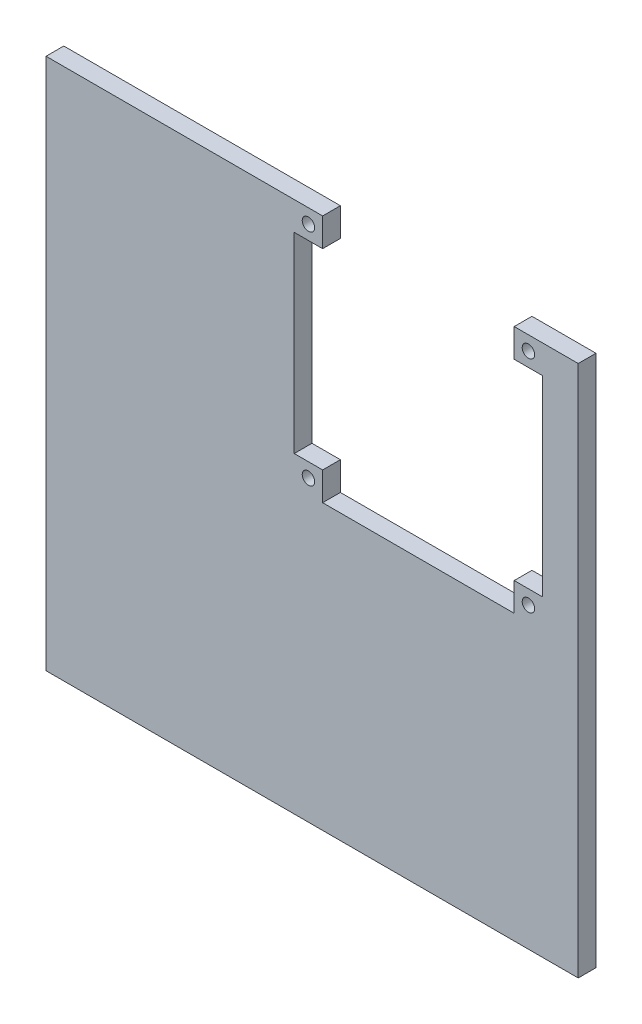
ISO-10303-21;
HEADER;
FILE_DESCRIPTION(('STEP AP214'),'2;1');
FILE_NAME('part.step','',(''),(''),'','','');
FILE_SCHEMA(('AUTOMOTIVE_DESIGN { 1 0 10303 214 1 1 1 1 }'));
ENDSEC;
DATA;
#1=APPLICATION_CONTEXT('core data for automotive mechanical design processes');
#2=APPLICATION_PROTOCOL_DEFINITION('international standard','automotive_design',2000,#1);
#3=PRODUCT_CONTEXT('',#1,'mechanical');
#4=PRODUCT('Part','Part','',(#3));
#5=PRODUCT_RELATED_PRODUCT_CATEGORY('part','',(#4));
#6=PRODUCT_DEFINITION_FORMATION('','',#4);
#7=PRODUCT_DEFINITION_CONTEXT('part definition',#1,'design');
#8=PRODUCT_DEFINITION('design','',#6,#7);
#9=PRODUCT_DEFINITION_SHAPE('','',#8);
#10=(LENGTH_UNIT() NAMED_UNIT(*) SI_UNIT(.MILLI.,.METRE.));
#11=(NAMED_UNIT(*) PLANE_ANGLE_UNIT() SI_UNIT($,.RADIAN.));
#12=(NAMED_UNIT(*) SI_UNIT($,.STERADIAN.) SOLID_ANGLE_UNIT());
#13=UNCERTAINTY_MEASURE_WITH_UNIT(LENGTH_MEASURE(1.E-05),#10,'distance_accuracy_value','');
#14=(GEOMETRIC_REPRESENTATION_CONTEXT(3) GLOBAL_UNCERTAINTY_ASSIGNED_CONTEXT((#13)) GLOBAL_UNIT_ASSIGNED_CONTEXT((#10,
#11,#12)) REPRESENTATION_CONTEXT('',''));
#15=CARTESIAN_POINT('',(0.,0.,0.));
#16=DIRECTION('',(0.,0.,1.));
#17=DIRECTION('',(1.,0.,0.));
#18=AXIS2_PLACEMENT_3D('',#15,#16,#17);
#19=CARTESIAN_POINT('',(0.,150.,5.));
#20=DIRECTION('',(0.,-1.,0.));
#21=DIRECTION('',(0.,0.,-1.));
#22=AXIS2_PLACEMENT_3D('',#19,#20,#21);
#23=PLANE('',#22);
#24=DIRECTION('',(-1.,0.,0.));
#25=VECTOR('',#24,1.);
#26=CARTESIAN_POINT('',(0.,150.,5.));
#27=LINE('',#26,#25);
#28=CARTESIAN_POINT('',(77.9600185654131,150.,5.));
#29=VERTEX_POINT('',#28);
#30=CARTESIAN_POINT('',(0.,150.,5.));
#31=VERTEX_POINT('',#30);
#32=EDGE_CURVE('E57',#29,#31,#27,.T.);
#33=ORIENTED_EDGE('',*,*,#32,.F.);
#34=DIRECTION('',(0.,0.,1.));
#35=VECTOR('',#34,1.);
#36=CARTESIAN_POINT('',(77.9600185654131,150.,0.));
#37=LINE('',#36,#35);
#38=CARTESIAN_POINT('',(77.9600185654131,150.,0.));
#39=VERTEX_POINT('',#38);
#40=EDGE_CURVE('E233',#39,#29,#37,.T.);
#41=ORIENTED_EDGE('',*,*,#40,.F.);
#42=DIRECTION('',(-1.,0.,0.));
#43=VECTOR('',#42,1.);
#44=CARTESIAN_POINT('',(0.,150.,0.));
#45=LINE('',#44,#43);
#46=CARTESIAN_POINT('',(0.,150.,0.));
#47=VERTEX_POINT('',#46);
#48=EDGE_CURVE('E79',#39,#47,#45,.T.);
#49=ORIENTED_EDGE('',*,*,#48,.T.);
#50=DIRECTION('',(0.,0.,-1.));
#51=VECTOR('',#50,1.);
#52=CARTESIAN_POINT('',(0.,150.,5.));
#53=LINE('',#52,#51);
#54=EDGE_CURVE('E265',#31,#47,#53,.T.);
#55=ORIENTED_EDGE('',*,*,#54,.F.);
#56=EDGE_LOOP('',(#33,#41,#49,#55));
#57=FACE_BOUND('',#56,.T.);
#58=ADVANCED_FACE('F33',(#57),#23,.F.);
#59=CARTESIAN_POINT('',(0.,0.,5.));
#60=DIRECTION('',(1.,0.,0.));
#61=DIRECTION('',(0.,0.,-1.));
#62=AXIS2_PLACEMENT_3D('',#59,#60,#61);
#63=PLANE('',#62);
#64=DIRECTION('',(0.,-1.,0.));
#65=VECTOR('',#64,1.);
#66=CARTESIAN_POINT('',(0.,0.,0.));
#67=LINE('',#66,#65);
#68=CARTESIAN_POINT('',(0.,0.,0.));
#69=VERTEX_POINT('',#68);
#70=EDGE_CURVE('E235',#47,#69,#67,.T.);
#71=ORIENTED_EDGE('',*,*,#70,.T.);
#72=DIRECTION('',(0.,0.,-1.));
#73=VECTOR('',#72,1.);
#74=CARTESIAN_POINT('',(0.,0.,5.));
#75=LINE('',#74,#73);
#76=CARTESIAN_POINT('',(0.,0.,5.));
#77=VERTEX_POINT('',#76);
#78=EDGE_CURVE('E11',#77,#69,#75,.T.);
#79=ORIENTED_EDGE('',*,*,#78,.F.);
#80=DIRECTION('',(0.,-1.,0.));
#81=VECTOR('',#80,1.);
#82=CARTESIAN_POINT('',(0.,0.,5.));
#83=LINE('',#82,#81);
#84=EDGE_CURVE('E256',#31,#77,#83,.T.);
#85=ORIENTED_EDGE('',*,*,#84,.F.);
#86=ORIENTED_EDGE('',*,*,#54,.T.);
#87=EDGE_LOOP('',(#71,#79,#85,#86));
#88=FACE_BOUND('',#87,.T.);
#89=ADVANCED_FACE('F35',(#88),#63,.F.);
#90=CARTESIAN_POINT('',(0.,0.,5.));
#91=DIRECTION('',(0.,1.,0.));
#92=DIRECTION('',(0.,0.,1.));
#93=AXIS2_PLACEMENT_3D('',#90,#91,#92);
#94=PLANE('',#93);
#95=DIRECTION('',(1.,0.,0.));
#96=VECTOR('',#95,1.);
#97=CARTESIAN_POINT('',(0.,0.,0.));
#98=LINE('',#97,#96);
#99=CARTESIAN_POINT('',(150.,0.,0.));
#100=VERTEX_POINT('',#99);
#101=EDGE_CURVE('E268',#69,#100,#98,.T.);
#102=ORIENTED_EDGE('',*,*,#101,.T.);
#103=DIRECTION('',(0.,0.,-1.));
#104=VECTOR('',#103,1.);
#105=CARTESIAN_POINT('',(150.,0.,5.));
#106=LINE('',#105,#104);
#107=CARTESIAN_POINT('',(150.,0.,5.));
#108=VERTEX_POINT('',#107);
#109=EDGE_CURVE('E41',#108,#100,#106,.T.);
#110=ORIENTED_EDGE('',*,*,#109,.F.);
#111=DIRECTION('',(1.,0.,0.));
#112=VECTOR('',#111,1.);
#113=CARTESIAN_POINT('',(0.,0.,5.));
#114=LINE('',#113,#112);
#115=EDGE_CURVE('E86',#77,#108,#114,.T.);
#116=ORIENTED_EDGE('',*,*,#115,.F.);
#117=ORIENTED_EDGE('',*,*,#78,.T.);
#118=EDGE_LOOP('',(#102,#110,#116,#117));
#119=FACE_BOUND('',#118,.T.);
#120=ADVANCED_FACE('F294',(#119),#94,.F.);
#121=CARTESIAN_POINT('',(150.,0.,5.));
#122=DIRECTION('',(-1.,0.,0.));
#123=DIRECTION('',(0.,0.,1.));
#124=AXIS2_PLACEMENT_3D('',#121,#122,#123);
#125=PLANE('',#124);
#126=DIRECTION('',(0.,1.,0.));
#127=VECTOR('',#126,1.);
#128=CARTESIAN_POINT('',(150.,0.,0.));
#129=LINE('',#128,#127);
#130=CARTESIAN_POINT('',(150.,150.,0.));
#131=VERTEX_POINT('',#130);
#132=EDGE_CURVE('E270',#100,#131,#129,.T.);
#133=ORIENTED_EDGE('',*,*,#132,.T.);
#134=DIRECTION('',(0.,0.,-1.));
#135=VECTOR('',#134,1.);
#136=CARTESIAN_POINT('',(150.,150.,5.));
#137=LINE('',#136,#135);
#138=CARTESIAN_POINT('',(150.,150.,5.));
#139=VERTEX_POINT('',#138);
#140=EDGE_CURVE('E275',#139,#131,#137,.T.);
#141=ORIENTED_EDGE('',*,*,#140,.F.);
#142=DIRECTION('',(0.,1.,0.));
#143=VECTOR('',#142,1.);
#144=CARTESIAN_POINT('',(150.,0.,5.));
#145=LINE('',#144,#143);
#146=EDGE_CURVE('E260',#108,#139,#145,.T.);
#147=ORIENTED_EDGE('',*,*,#146,.F.);
#148=ORIENTED_EDGE('',*,*,#109,.T.);
#149=EDGE_LOOP('',(#133,#141,#147,#148));
#150=FACE_BOUND('',#149,.T.);
#151=ADVANCED_FACE('F281',(#150),#125,.F.);
#152=CARTESIAN_POINT('',(131.960018565413,150.,0.));
#153=VERTEX_POINT('',#152);
#154=EDGE_CURVE('E258',#131,#153,#45,.T.);
#155=ORIENTED_EDGE('',*,*,#154,.T.);
#156=DIRECTION('',(0.,0.,1.));
#157=VECTOR('',#156,1.);
#158=CARTESIAN_POINT('',(131.960018565413,150.,0.));
#159=LINE('',#158,#157);
#160=CARTESIAN_POINT('',(131.960018565413,150.,5.));
#161=VERTEX_POINT('',#160);
#162=EDGE_CURVE('E236',#153,#161,#159,.T.);
#163=ORIENTED_EDGE('',*,*,#162,.T.);
#164=EDGE_CURVE('E262',#139,#161,#27,.T.);
#165=ORIENTED_EDGE('',*,*,#164,.F.);
#166=ORIENTED_EDGE('',*,*,#140,.T.);
#167=EDGE_LOOP('',(#155,#163,#165,#166));
#168=FACE_BOUND('',#167,.T.);
#169=ADVANCED_FACE('F286',(#168),#23,.F.);
#170=CARTESIAN_POINT('',(0.,0.,5.));
#171=DIRECTION('',(0.,0.,-1.));
#172=DIRECTION('',(-1.,0.,0.));
#173=AXIS2_PLACEMENT_3D('',#170,#171,#172);
#174=PLANE('',#173);
#175=CARTESIAN_POINT('',(135.960018565413,84.,5.));
#176=DIRECTION('',(0.,0.,1.));
#177=DIRECTION('',(1.,0.,0.));
#178=AXIS2_PLACEMENT_3D('',#175,#176,#177);
#179=CIRCLE('',#178,1.75000000000001);
#180=CARTESIAN_POINT('',(137.710018565413,84.,5.));
#181=VERTEX_POINT('',#180);
#182=EDGE_CURVE('E179',#181,#181,#179,.T.);
#183=ORIENTED_EDGE('',*,*,#182,.F.);
#184=EDGE_LOOP('',(#183));
#185=FACE_BOUND('',#184,.T.);
#186=CARTESIAN_POINT('',(135.960018565413,146.,5.));
#187=DIRECTION('',(0.,0.,1.));
#188=DIRECTION('',(1.,0.,0.));
#189=AXIS2_PLACEMENT_3D('',#186,#187,#188);
#190=CIRCLE('',#189,1.75000000000001);
#191=CARTESIAN_POINT('',(137.710018565413,146.,5.));
#192=VERTEX_POINT('',#191);
#193=EDGE_CURVE('E394',#192,#192,#190,.T.);
#194=ORIENTED_EDGE('',*,*,#193,.F.);
#195=EDGE_LOOP('',(#194));
#196=FACE_BOUND('',#195,.T.);
#197=CARTESIAN_POINT('',(73.9600185654131,146.,5.));
#198=DIRECTION('',(0.,0.,1.));
#199=DIRECTION('',(1.,0.,0.));
#200=AXIS2_PLACEMENT_3D('',#197,#198,#199);
#201=CIRCLE('',#200,1.75);
#202=CARTESIAN_POINT('',(75.7100185654131,146.,5.));
#203=VERTEX_POINT('',#202);
#204=EDGE_CURVE('E386',#203,#203,#201,.T.);
#205=ORIENTED_EDGE('',*,*,#204,.F.);
#206=EDGE_LOOP('',(#205));
#207=FACE_BOUND('',#206,.T.);
#208=CARTESIAN_POINT('',(73.960018565413,84.,5.));
#209=DIRECTION('',(0.,0.,1.));
#210=DIRECTION('',(1.,0.,0.));
#211=AXIS2_PLACEMENT_3D('',#208,#209,#210);
#212=CIRCLE('',#211,1.75);
#213=CARTESIAN_POINT('',(75.710018565413,84.,5.));
#214=VERTEX_POINT('',#213);
#215=EDGE_CURVE('E380',#214,#214,#212,.T.);
#216=ORIENTED_EDGE('',*,*,#215,.F.);
#217=EDGE_LOOP('',(#216));
#218=FACE_BOUND('',#217,.T.);
#219=DIRECTION('',(-1.,0.,0.));
#220=VECTOR('',#219,1.);
#221=CARTESIAN_POINT('',(69.960018565413,142.,5.));
#222=LINE('',#221,#220);
#223=CARTESIAN_POINT('',(77.9600185654131,142.,5.));
#224=VERTEX_POINT('',#223);
#225=CARTESIAN_POINT('',(69.960018565413,142.,5.));
#226=VERTEX_POINT('',#225);
#227=EDGE_CURVE('E207',#224,#226,#222,.T.);
#228=ORIENTED_EDGE('',*,*,#227,.F.);
#229=DIRECTION('',(0.,-1.,0.));
#230=VECTOR('',#229,1.);
#231=CARTESIAN_POINT('',(77.9600185654131,142.,5.));
#232=LINE('',#231,#230);
#233=EDGE_CURVE('E160',#29,#224,#232,.T.);
#234=ORIENTED_EDGE('',*,*,#233,.F.);
#235=ORIENTED_EDGE('',*,*,#32,.T.);
#236=ORIENTED_EDGE('',*,*,#84,.T.);
#237=ORIENTED_EDGE('',*,*,#115,.T.);
#238=ORIENTED_EDGE('',*,*,#146,.T.);
#239=ORIENTED_EDGE('',*,*,#164,.T.);
#240=DIRECTION('',(0.,1.,0.));
#241=VECTOR('',#240,1.);
#242=CARTESIAN_POINT('',(131.960018565413,150.,5.));
#243=LINE('',#242,#241);
#244=CARTESIAN_POINT('',(131.960018565413,142.,5.));
#245=VERTEX_POINT('',#244);
#246=EDGE_CURVE('E174',#245,#161,#243,.T.);
#247=ORIENTED_EDGE('',*,*,#246,.F.);
#248=DIRECTION('',(-1.,0.,0.));
#249=VECTOR('',#248,1.);
#250=CARTESIAN_POINT('',(131.960018565413,142.,5.));
#251=LINE('',#250,#249);
#252=CARTESIAN_POINT('',(139.960018565413,142.,5.));
#253=VERTEX_POINT('',#252);
#254=EDGE_CURVE('E176',#253,#245,#251,.T.);
#255=ORIENTED_EDGE('',*,*,#254,.F.);
#256=DIRECTION('',(0.,1.,0.));
#257=VECTOR('',#256,1.);
#258=CARTESIAN_POINT('',(139.960018565413,142.,5.));
#259=LINE('',#258,#257);
#260=CARTESIAN_POINT('',(139.960018565413,88.,5.));
#261=VERTEX_POINT('',#260);
#262=EDGE_CURVE('E228',#261,#253,#259,.T.);
#263=ORIENTED_EDGE('',*,*,#262,.F.);
#264=DIRECTION('',(1.,0.,0.));
#265=VECTOR('',#264,1.);
#266=CARTESIAN_POINT('',(139.960018565413,88.,5.));
#267=LINE('',#266,#265);
#268=CARTESIAN_POINT('',(131.960018565413,88.,5.));
#269=VERTEX_POINT('',#268);
#270=EDGE_CURVE('E225',#269,#261,#267,.T.);
#271=ORIENTED_EDGE('',*,*,#270,.F.);
#272=DIRECTION('',(0.,1.,0.));
#273=VECTOR('',#272,1.);
#274=CARTESIAN_POINT('',(131.960018565413,88.,5.));
#275=LINE('',#274,#273);
#276=CARTESIAN_POINT('',(131.960018565413,80.,5.));
#277=VERTEX_POINT('',#276);
#278=EDGE_CURVE('E222',#277,#269,#275,.T.);
#279=ORIENTED_EDGE('',*,*,#278,.F.);
#280=DIRECTION('',(1.,0.,0.));
#281=VECTOR('',#280,1.);
#282=CARTESIAN_POINT('',(131.960018565413,80.,5.));
#283=LINE('',#282,#281);
#284=CARTESIAN_POINT('',(77.9600185654131,80.,5.));
#285=VERTEX_POINT('',#284);
#286=EDGE_CURVE('E219',#285,#277,#283,.T.);
#287=ORIENTED_EDGE('',*,*,#286,.F.);
#288=DIRECTION('',(0.,-1.,0.));
#289=VECTOR('',#288,1.);
#290=CARTESIAN_POINT('',(77.9600185654131,80.,5.));
#291=LINE('',#290,#289);
#292=CARTESIAN_POINT('',(77.9600185654131,87.9999999999999,5.));
#293=VERTEX_POINT('',#292);
#294=EDGE_CURVE('E216',#293,#285,#291,.T.);
#295=ORIENTED_EDGE('',*,*,#294,.F.);
#296=DIRECTION('',(1.,0.,0.));
#297=VECTOR('',#296,1.);
#298=CARTESIAN_POINT('',(77.9600185654131,87.9999999999999,5.));
#299=LINE('',#298,#297);
#300=CARTESIAN_POINT('',(69.960018565413,87.9999999999999,5.));
#301=VERTEX_POINT('',#300);
#302=EDGE_CURVE('E213',#301,#293,#299,.T.);
#303=ORIENTED_EDGE('',*,*,#302,.F.);
#304=DIRECTION('',(0.,-1.,0.));
#305=VECTOR('',#304,1.);
#306=CARTESIAN_POINT('',(69.960018565413,87.9999999999999,5.));
#307=LINE('',#306,#305);
#308=EDGE_CURVE('E210',#226,#301,#307,.T.);
#309=ORIENTED_EDGE('',*,*,#308,.F.);
#310=EDGE_LOOP('',(#228,#234,#235,#236,#237,#238,#239,#247,#255,#263,#271,#279,#287,#295,#303,#309));
#311=FACE_BOUND('',#310,.T.);
#312=ADVANCED_FACE('F289',(#185,#196,#207,#218,#311),#174,.F.);
#313=CARTESIAN_POINT('',(0.,0.,0.));
#314=DIRECTION('',(0.,0.,-1.));
#315=DIRECTION('',(-1.,0.,0.));
#316=AXIS2_PLACEMENT_3D('',#313,#314,#315);
#317=PLANE('',#316);
#318=CARTESIAN_POINT('',(135.960018565413,84.,0.));
#319=DIRECTION('',(0.,0.,1.));
#320=DIRECTION('',(1.,0.,0.));
#321=AXIS2_PLACEMENT_3D('',#318,#319,#320);
#322=CIRCLE('',#321,1.75000000000001);
#323=CARTESIAN_POINT('',(137.710018565413,84.,0.));
#324=VERTEX_POINT('',#323);
#325=EDGE_CURVE('E396',#324,#324,#322,.T.);
#326=ORIENTED_EDGE('',*,*,#325,.T.);
#327=EDGE_LOOP('',(#326));
#328=FACE_BOUND('',#327,.T.);
#329=CARTESIAN_POINT('',(135.960018565413,146.,0.));
#330=DIRECTION('',(0.,0.,1.));
#331=DIRECTION('',(1.,0.,0.));
#332=AXIS2_PLACEMENT_3D('',#329,#330,#331);
#333=CIRCLE('',#332,1.75000000000001);
#334=CARTESIAN_POINT('',(137.710018565413,146.,0.));
#335=VERTEX_POINT('',#334);
#336=EDGE_CURVE('E391',#335,#335,#333,.T.);
#337=ORIENTED_EDGE('',*,*,#336,.T.);
#338=EDGE_LOOP('',(#337));
#339=FACE_BOUND('',#338,.T.);
#340=CARTESIAN_POINT('',(73.9600185654131,146.,0.));
#341=DIRECTION('',(0.,0.,1.));
#342=DIRECTION('',(1.,0.,0.));
#343=AXIS2_PLACEMENT_3D('',#340,#341,#342);
#344=CIRCLE('',#343,1.75);
#345=CARTESIAN_POINT('',(75.7100185654131,146.,0.));
#346=VERTEX_POINT('',#345);
#347=EDGE_CURVE('E382',#346,#346,#344,.T.);
#348=ORIENTED_EDGE('',*,*,#347,.T.);
#349=EDGE_LOOP('',(#348));
#350=FACE_BOUND('',#349,.T.);
#351=CARTESIAN_POINT('',(73.960018565413,84.,0.));
#352=DIRECTION('',(0.,0.,1.));
#353=DIRECTION('',(1.,0.,0.));
#354=AXIS2_PLACEMENT_3D('',#351,#352,#353);
#355=CIRCLE('',#354,1.75);
#356=CARTESIAN_POINT('',(75.710018565413,84.,0.));
#357=VERTEX_POINT('',#356);
#358=EDGE_CURVE('E208',#357,#357,#355,.T.);
#359=ORIENTED_EDGE('',*,*,#358,.T.);
#360=EDGE_LOOP('',(#359));
#361=FACE_BOUND('',#360,.T.);
#362=DIRECTION('',(0.,-1.,0.));
#363=VECTOR('',#362,1.);
#364=CARTESIAN_POINT('',(77.9600185654131,142.,0.));
#365=LINE('',#364,#363);
#366=CARTESIAN_POINT('',(77.9600185654131,142.,0.));
#367=VERTEX_POINT('',#366);
#368=EDGE_CURVE('E159',#39,#367,#365,.T.);
#369=ORIENTED_EDGE('',*,*,#368,.T.);
#370=DIRECTION('',(-1.,0.,0.));
#371=VECTOR('',#370,1.);
#372=CARTESIAN_POINT('',(69.960018565413,142.,0.));
#373=LINE('',#372,#371);
#374=CARTESIAN_POINT('',(69.960018565413,142.,0.));
#375=VERTEX_POINT('',#374);
#376=EDGE_CURVE('E168',#367,#375,#373,.T.);
#377=ORIENTED_EDGE('',*,*,#376,.T.);
#378=DIRECTION('',(0.,-1.,0.));
#379=VECTOR('',#378,1.);
#380=CARTESIAN_POINT('',(69.960018565413,87.9999999999999,0.));
#381=LINE('',#380,#379);
#382=CARTESIAN_POINT('',(69.960018565413,87.9999999999999,0.));
#383=VERTEX_POINT('',#382);
#384=EDGE_CURVE('E48',#375,#383,#381,.T.);
#385=ORIENTED_EDGE('',*,*,#384,.T.);
#386=DIRECTION('',(1.,0.,0.));
#387=VECTOR('',#386,1.);
#388=CARTESIAN_POINT('',(77.9600185654131,87.9999999999999,0.));
#389=LINE('',#388,#387);
#390=CARTESIAN_POINT('',(77.9600185654131,87.9999999999999,0.));
#391=VERTEX_POINT('',#390);
#392=EDGE_CURVE('E183',#383,#391,#389,.T.);
#393=ORIENTED_EDGE('',*,*,#392,.T.);
#394=DIRECTION('',(0.,-1.,0.));
#395=VECTOR('',#394,1.);
#396=CARTESIAN_POINT('',(77.9600185654131,80.,0.));
#397=LINE('',#396,#395);
#398=CARTESIAN_POINT('',(77.9600185654131,80.,0.));
#399=VERTEX_POINT('',#398);
#400=EDGE_CURVE('E186',#391,#399,#397,.T.);
#401=ORIENTED_EDGE('',*,*,#400,.T.);
#402=DIRECTION('',(1.,0.,0.));
#403=VECTOR('',#402,1.);
#404=CARTESIAN_POINT('',(131.960018565413,80.,0.));
#405=LINE('',#404,#403);
#406=CARTESIAN_POINT('',(131.960018565413,80.,0.));
#407=VERTEX_POINT('',#406);
#408=EDGE_CURVE('E189',#399,#407,#405,.T.);
#409=ORIENTED_EDGE('',*,*,#408,.T.);
#410=DIRECTION('',(0.,1.,0.));
#411=VECTOR('',#410,1.);
#412=CARTESIAN_POINT('',(131.960018565413,88.,0.));
#413=LINE('',#412,#411);
#414=CARTESIAN_POINT('',(131.960018565413,88.,0.));
#415=VERTEX_POINT('',#414);
#416=EDGE_CURVE('E192',#407,#415,#413,.T.);
#417=ORIENTED_EDGE('',*,*,#416,.T.);
#418=DIRECTION('',(1.,0.,0.));
#419=VECTOR('',#418,1.);
#420=CARTESIAN_POINT('',(139.960018565413,88.,0.));
#421=LINE('',#420,#419);
#422=CARTESIAN_POINT('',(139.960018565413,88.,0.));
#423=VERTEX_POINT('',#422);
#424=EDGE_CURVE('E195',#415,#423,#421,.T.);
#425=ORIENTED_EDGE('',*,*,#424,.T.);
#426=DIRECTION('',(0.,1.,0.));
#427=VECTOR('',#426,1.);
#428=CARTESIAN_POINT('',(139.960018565413,142.,0.));
#429=LINE('',#428,#427);
#430=CARTESIAN_POINT('',(139.960018565413,142.,0.));
#431=VERTEX_POINT('',#430);
#432=EDGE_CURVE('E198',#423,#431,#429,.T.);
#433=ORIENTED_EDGE('',*,*,#432,.T.);
#434=DIRECTION('',(-1.,0.,0.));
#435=VECTOR('',#434,1.);
#436=CARTESIAN_POINT('',(131.960018565413,142.,0.));
#437=LINE('',#436,#435);
#438=CARTESIAN_POINT('',(131.960018565413,142.,0.));
#439=VERTEX_POINT('',#438);
#440=EDGE_CURVE('E201',#431,#439,#437,.T.);
#441=ORIENTED_EDGE('',*,*,#440,.T.);
#442=DIRECTION('',(0.,1.,0.));
#443=VECTOR('',#442,1.);
#444=CARTESIAN_POINT('',(131.960018565413,150.,0.));
#445=LINE('',#444,#443);
#446=EDGE_CURVE('E165',#439,#153,#445,.T.);
#447=ORIENTED_EDGE('',*,*,#446,.T.);
#448=ORIENTED_EDGE('',*,*,#154,.F.);
#449=ORIENTED_EDGE('',*,*,#132,.F.);
#450=ORIENTED_EDGE('',*,*,#101,.F.);
#451=ORIENTED_EDGE('',*,*,#70,.F.);
#452=ORIENTED_EDGE('',*,*,#48,.F.);
#453=EDGE_LOOP('',(#369,#377,#385,#393,#401,#409,#417,#425,#433,#441,#447,#448,#449,#450,#451,#452));
#454=FACE_BOUND('',#453,.T.);
#455=ADVANCED_FACE('F172',(#328,#339,#350,#361,#454),#317,.T.);
#456=CARTESIAN_POINT('',(77.9600185654131,142.,0.));
#457=DIRECTION('',(-1.,0.,0.));
#458=DIRECTION('',(0.,0.,1.));
#459=AXIS2_PLACEMENT_3D('',#456,#457,#458);
#460=PLANE('',#459);
#461=ORIENTED_EDGE('',*,*,#233,.T.);
#462=DIRECTION('',(0.,0.,1.));
#463=VECTOR('',#462,1.);
#464=CARTESIAN_POINT('',(77.9600185654131,142.,0.));
#465=LINE('',#464,#463);
#466=EDGE_CURVE('E155',#367,#224,#465,.T.);
#467=ORIENTED_EDGE('',*,*,#466,.F.);
#468=ORIENTED_EDGE('',*,*,#368,.F.);
#469=ORIENTED_EDGE('',*,*,#40,.T.);
#470=EDGE_LOOP('',(#461,#467,#468,#469));
#471=FACE_BOUND('',#470,.T.);
#472=ADVANCED_FACE('F157',(#471),#460,.F.);
#473=CARTESIAN_POINT('',(131.960018565413,150.,0.));
#474=DIRECTION('',(1.,0.,0.));
#475=DIRECTION('',(0.,0.,-1.));
#476=AXIS2_PLACEMENT_3D('',#473,#474,#475);
#477=PLANE('',#476);
#478=ORIENTED_EDGE('',*,*,#246,.T.);
#479=ORIENTED_EDGE('',*,*,#162,.F.);
#480=ORIENTED_EDGE('',*,*,#446,.F.);
#481=DIRECTION('',(0.,0.,1.));
#482=VECTOR('',#481,1.);
#483=CARTESIAN_POINT('',(131.960018565413,142.,0.));
#484=LINE('',#483,#482);
#485=EDGE_CURVE('E239',#439,#245,#484,.T.);
#486=ORIENTED_EDGE('',*,*,#485,.T.);
#487=EDGE_LOOP('',(#478,#479,#480,#486));
#488=FACE_BOUND('',#487,.T.);
#489=ADVANCED_FACE('F321',(#488),#477,.F.);
#490=CARTESIAN_POINT('',(131.960018565413,142.,0.));
#491=DIRECTION('',(0.,1.,0.));
#492=DIRECTION('',(-1.,0.,0.));
#493=AXIS2_PLACEMENT_3D('',#490,#491,#492);
#494=PLANE('',#493);
#495=ORIENTED_EDGE('',*,*,#254,.T.);
#496=ORIENTED_EDGE('',*,*,#485,.F.);
#497=ORIENTED_EDGE('',*,*,#440,.F.);
#498=DIRECTION('',(0.,0.,1.));
#499=VECTOR('',#498,1.);
#500=CARTESIAN_POINT('',(139.960018565413,142.,0.));
#501=LINE('',#500,#499);
#502=EDGE_CURVE('E241',#431,#253,#501,.T.);
#503=ORIENTED_EDGE('',*,*,#502,.T.);
#504=EDGE_LOOP('',(#495,#496,#497,#503));
#505=FACE_BOUND('',#504,.T.);
#506=ADVANCED_FACE('F351',(#505),#494,.F.);
#507=CARTESIAN_POINT('',(139.960018565413,142.,0.));
#508=DIRECTION('',(1.,0.,0.));
#509=DIRECTION('',(0.,1.,0.));
#510=AXIS2_PLACEMENT_3D('',#507,#508,#509);
#511=PLANE('',#510);
#512=ORIENTED_EDGE('',*,*,#262,.T.);
#513=ORIENTED_EDGE('',*,*,#502,.F.);
#514=ORIENTED_EDGE('',*,*,#432,.F.);
#515=DIRECTION('',(0.,0.,1.));
#516=VECTOR('',#515,1.);
#517=CARTESIAN_POINT('',(139.960018565413,88.,0.));
#518=LINE('',#517,#516);
#519=EDGE_CURVE('E243',#423,#261,#518,.T.);
#520=ORIENTED_EDGE('',*,*,#519,.T.);
#521=EDGE_LOOP('',(#512,#513,#514,#520));
#522=FACE_BOUND('',#521,.T.);
#523=ADVANCED_FACE('F347',(#522),#511,.F.);
#524=CARTESIAN_POINT('',(139.960018565413,88.,0.));
#525=DIRECTION('',(0.,-1.,0.));
#526=DIRECTION('',(0.,0.,-1.));
#527=AXIS2_PLACEMENT_3D('',#524,#525,#526);
#528=PLANE('',#527);
#529=ORIENTED_EDGE('',*,*,#270,.T.);
#530=ORIENTED_EDGE('',*,*,#519,.F.);
#531=ORIENTED_EDGE('',*,*,#424,.F.);
#532=DIRECTION('',(0.,0.,1.));
#533=VECTOR('',#532,1.);
#534=CARTESIAN_POINT('',(131.960018565413,88.,0.));
#535=LINE('',#534,#533);
#536=EDGE_CURVE('E245',#415,#269,#535,.T.);
#537=ORIENTED_EDGE('',*,*,#536,.T.);
#538=EDGE_LOOP('',(#529,#530,#531,#537));
#539=FACE_BOUND('',#538,.T.);
#540=ADVANCED_FACE('F343',(#539),#528,.F.);
#541=CARTESIAN_POINT('',(131.960018565413,88.,0.));
#542=DIRECTION('',(1.,0.,0.));
#543=DIRECTION('',(0.,0.,-1.));
#544=AXIS2_PLACEMENT_3D('',#541,#542,#543);
#545=PLANE('',#544);
#546=ORIENTED_EDGE('',*,*,#278,.T.);
#547=ORIENTED_EDGE('',*,*,#536,.F.);
#548=ORIENTED_EDGE('',*,*,#416,.F.);
#549=DIRECTION('',(0.,0.,1.));
#550=VECTOR('',#549,1.);
#551=CARTESIAN_POINT('',(131.960018565413,80.,0.));
#552=LINE('',#551,#550);
#553=EDGE_CURVE('E247',#407,#277,#552,.T.);
#554=ORIENTED_EDGE('',*,*,#553,.T.);
#555=EDGE_LOOP('',(#546,#547,#548,#554));
#556=FACE_BOUND('',#555,.T.);
#557=ADVANCED_FACE('F339',(#556),#545,.F.);
#558=CARTESIAN_POINT('',(131.960018565413,80.,0.));
#559=DIRECTION('',(0.,-1.,0.));
#560=DIRECTION('',(0.,0.,-1.));
#561=AXIS2_PLACEMENT_3D('',#558,#559,#560);
#562=PLANE('',#561);
#563=ORIENTED_EDGE('',*,*,#286,.T.);
#564=ORIENTED_EDGE('',*,*,#553,.F.);
#565=ORIENTED_EDGE('',*,*,#408,.F.);
#566=DIRECTION('',(0.,0.,1.));
#567=VECTOR('',#566,1.);
#568=CARTESIAN_POINT('',(77.9600185654131,80.,0.));
#569=LINE('',#568,#567);
#570=EDGE_CURVE('E249',#399,#285,#569,.T.);
#571=ORIENTED_EDGE('',*,*,#570,.T.);
#572=EDGE_LOOP('',(#563,#564,#565,#571));
#573=FACE_BOUND('',#572,.T.);
#574=ADVANCED_FACE('F335',(#573),#562,.F.);
#575=CARTESIAN_POINT('',(77.9600185654131,80.,0.));
#576=DIRECTION('',(-1.,0.,0.));
#577=DIRECTION('',(0.,0.,1.));
#578=AXIS2_PLACEMENT_3D('',#575,#576,#577);
#579=PLANE('',#578);
#580=ORIENTED_EDGE('',*,*,#294,.T.);
#581=ORIENTED_EDGE('',*,*,#570,.F.);
#582=ORIENTED_EDGE('',*,*,#400,.F.);
#583=DIRECTION('',(0.,0.,1.));
#584=VECTOR('',#583,1.);
#585=CARTESIAN_POINT('',(77.9600185654131,87.9999999999999,0.));
#586=LINE('',#585,#584);
#587=EDGE_CURVE('E251',#391,#293,#586,.T.);
#588=ORIENTED_EDGE('',*,*,#587,.T.);
#589=EDGE_LOOP('',(#580,#581,#582,#588));
#590=FACE_BOUND('',#589,.T.);
#591=ADVANCED_FACE('F331',(#590),#579,.F.);
#592=CARTESIAN_POINT('',(77.9600185654131,87.9999999999999,0.));
#593=DIRECTION('',(0.,-1.,0.));
#594=DIRECTION('',(0.,0.,-1.));
#595=AXIS2_PLACEMENT_3D('',#592,#593,#594);
#596=PLANE('',#595);
#597=ORIENTED_EDGE('',*,*,#302,.T.);
#598=ORIENTED_EDGE('',*,*,#587,.F.);
#599=ORIENTED_EDGE('',*,*,#392,.F.);
#600=DIRECTION('',(0.,0.,1.));
#601=VECTOR('',#600,1.);
#602=CARTESIAN_POINT('',(69.960018565413,87.9999999999999,0.));
#603=LINE('',#602,#601);
#604=EDGE_CURVE('E253',#383,#301,#603,.T.);
#605=ORIENTED_EDGE('',*,*,#604,.T.);
#606=EDGE_LOOP('',(#597,#598,#599,#605));
#607=FACE_BOUND('',#606,.T.);
#608=ADVANCED_FACE('F328',(#607),#596,.F.);
#609=CARTESIAN_POINT('',(69.960018565413,87.9999999999999,0.));
#610=DIRECTION('',(-1.,0.,0.));
#611=DIRECTION('',(0.,-1.,0.));
#612=AXIS2_PLACEMENT_3D('',#609,#610,#611);
#613=PLANE('',#612);
#614=ORIENTED_EDGE('',*,*,#308,.T.);
#615=ORIENTED_EDGE('',*,*,#604,.F.);
#616=ORIENTED_EDGE('',*,*,#384,.F.);
#617=DIRECTION('',(0.,0.,1.));
#618=VECTOR('',#617,1.);
#619=CARTESIAN_POINT('',(69.960018565413,142.,0.));
#620=LINE('',#619,#618);
#621=EDGE_CURVE('E164',#375,#226,#620,.T.);
#622=ORIENTED_EDGE('',*,*,#621,.T.);
#623=EDGE_LOOP('',(#614,#615,#616,#622));
#624=FACE_BOUND('',#623,.T.);
#625=ADVANCED_FACE('F325',(#624),#613,.F.);
#626=CARTESIAN_POINT('',(69.960018565413,142.,0.));
#627=DIRECTION('',(0.,1.,0.));
#628=DIRECTION('',(0.,0.,1.));
#629=AXIS2_PLACEMENT_3D('',#626,#627,#628);
#630=PLANE('',#629);
#631=ORIENTED_EDGE('',*,*,#227,.T.);
#632=ORIENTED_EDGE('',*,*,#621,.F.);
#633=ORIENTED_EDGE('',*,*,#376,.F.);
#634=ORIENTED_EDGE('',*,*,#466,.T.);
#635=EDGE_LOOP('',(#631,#632,#633,#634));
#636=FACE_BOUND('',#635,.T.);
#637=ADVANCED_FACE('F169',(#636),#630,.F.);
#638=CARTESIAN_POINT('',(73.960018565413,84.,0.));
#639=DIRECTION('',(0.,0.,1.));
#640=DIRECTION('',(1.,0.,0.));
#641=AXIS2_PLACEMENT_3D('',#638,#639,#640);
#642=CYLINDRICAL_SURFACE('',#641,1.75);
#643=ORIENTED_EDGE('',*,*,#358,.F.);
#644=EDGE_LOOP('',(#643));
#645=FACE_BOUND('',#644,.T.);
#646=ORIENTED_EDGE('',*,*,#215,.T.);
#647=EDGE_LOOP('',(#646));
#648=FACE_BOUND('',#647,.T.);
#649=ADVANCED_FACE('F324',(#645,#648),#642,.F.);
#650=CARTESIAN_POINT('',(73.9600185654131,146.,0.));
#651=DIRECTION('',(0.,0.,1.));
#652=DIRECTION('',(1.,0.,0.));
#653=AXIS2_PLACEMENT_3D('',#650,#651,#652);
#654=CYLINDRICAL_SURFACE('',#653,1.75);
#655=ORIENTED_EDGE('',*,*,#347,.F.);
#656=EDGE_LOOP('',(#655));
#657=FACE_BOUND('',#656,.T.);
#658=ORIENTED_EDGE('',*,*,#204,.T.);
#659=EDGE_LOOP('',(#658));
#660=FACE_BOUND('',#659,.T.);
#661=ADVANCED_FACE('F366',(#657,#660),#654,.F.);
#662=CARTESIAN_POINT('',(135.960018565413,146.,0.));
#663=DIRECTION('',(0.,0.,1.));
#664=DIRECTION('',(1.,0.,0.));
#665=AXIS2_PLACEMENT_3D('',#662,#663,#664);
#666=CYLINDRICAL_SURFACE('',#665,1.75000000000001);
#667=ORIENTED_EDGE('',*,*,#336,.F.);
#668=EDGE_LOOP('',(#667));
#669=FACE_BOUND('',#668,.T.);
#670=ORIENTED_EDGE('',*,*,#193,.T.);
#671=EDGE_LOOP('',(#670));
#672=FACE_BOUND('',#671,.T.);
#673=ADVANCED_FACE('F362',(#669,#672),#666,.F.);
#674=CARTESIAN_POINT('',(135.960018565413,84.,0.));
#675=DIRECTION('',(0.,0.,1.));
#676=DIRECTION('',(1.,0.,0.));
#677=AXIS2_PLACEMENT_3D('',#674,#675,#676);
#678=CYLINDRICAL_SURFACE('',#677,1.75000000000001);
#679=ORIENTED_EDGE('',*,*,#325,.F.);
#680=EDGE_LOOP('',(#679));
#681=FACE_BOUND('',#680,.T.);
#682=ORIENTED_EDGE('',*,*,#182,.T.);
#683=EDGE_LOOP('',(#682));
#684=FACE_BOUND('',#683,.T.);
#685=ADVANCED_FACE('F359',(#681,#684),#678,.F.);
#686=CLOSED_SHELL('',(#58,#89,#120,#151,#169,#312,#455,#472,#489,#506,#523,#540,#557,#574,#591,
#608,#625,#637,#649,#661,#673,#685));
#687=MANIFOLD_SOLID_BREP('B2',#686);
#688=ADVANCED_BREP_SHAPE_REPRESENTATION('',(#18,#687),#14);
#689=SHAPE_DEFINITION_REPRESENTATION(#9,#688);
ENDSEC;
END-ISO-10303-21;
